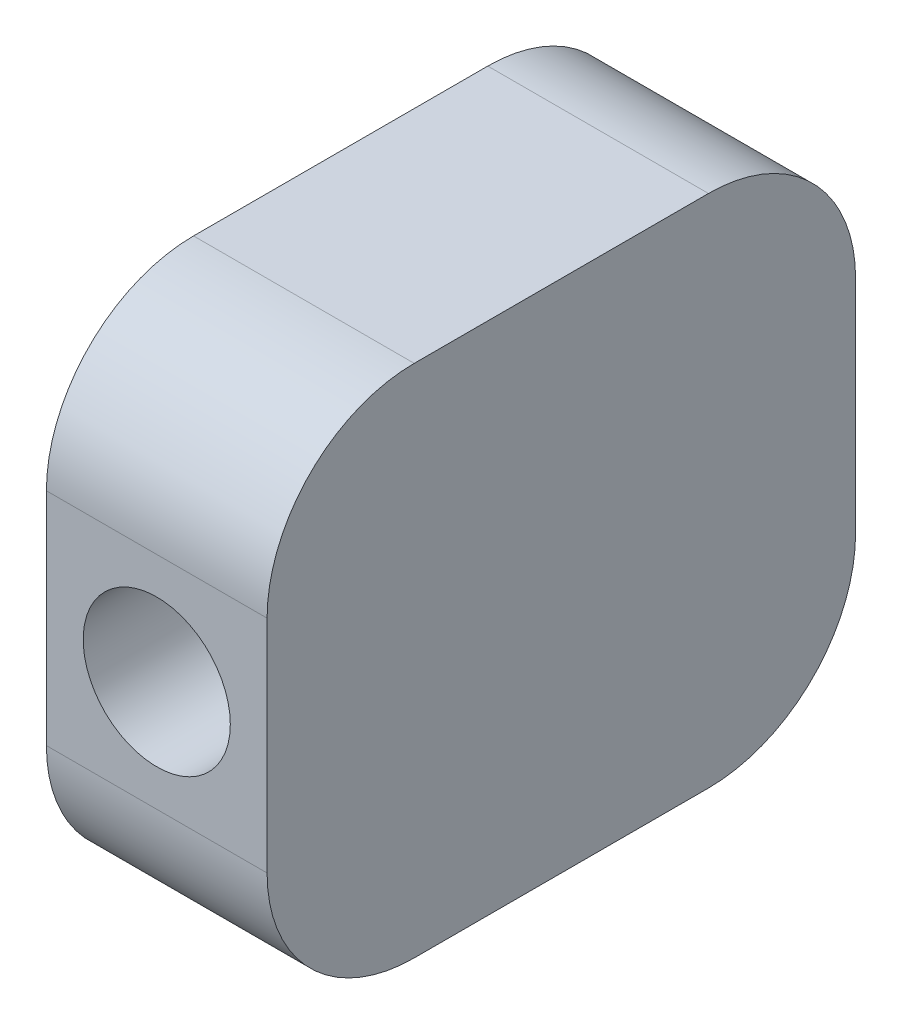
ISO-10303-21;
HEADER;
FILE_DESCRIPTION(('STEP AP214'),'2;1');
FILE_NAME('part.step','',(''),(''),'','','');
FILE_SCHEMA(('AUTOMOTIVE_DESIGN { 1 0 10303 214 1 1 1 1 }'));
ENDSEC;
DATA;
#1=APPLICATION_CONTEXT('core data for automotive mechanical design processes');
#2=APPLICATION_PROTOCOL_DEFINITION('international standard','automotive_design',2000,#1);
#3=PRODUCT_CONTEXT('',#1,'mechanical');
#4=PRODUCT('Part','Part','',(#3));
#5=PRODUCT_RELATED_PRODUCT_CATEGORY('part','',(#4));
#6=PRODUCT_DEFINITION_FORMATION('','',#4);
#7=PRODUCT_DEFINITION_CONTEXT('part definition',#1,'design');
#8=PRODUCT_DEFINITION('design','',#6,#7);
#9=PRODUCT_DEFINITION_SHAPE('','',#8);
#10=(LENGTH_UNIT() NAMED_UNIT(*) SI_UNIT(.MILLI.,.METRE.));
#11=(NAMED_UNIT(*) PLANE_ANGLE_UNIT() SI_UNIT($,.RADIAN.));
#12=(NAMED_UNIT(*) SI_UNIT($,.STERADIAN.) SOLID_ANGLE_UNIT());
#13=UNCERTAINTY_MEASURE_WITH_UNIT(LENGTH_MEASURE(1.E-05),#10,'distance_accuracy_value','');
#14=(GEOMETRIC_REPRESENTATION_CONTEXT(3) GLOBAL_UNCERTAINTY_ASSIGNED_CONTEXT((#13)) GLOBAL_UNIT_ASSIGNED_CONTEXT((#10,
#11,#12)) REPRESENTATION_CONTEXT('',''));
#15=CARTESIAN_POINT('',(0.,0.,0.));
#16=DIRECTION('',(0.,0.,1.));
#17=DIRECTION('',(1.,0.,0.));
#18=AXIS2_PLACEMENT_3D('',#15,#16,#17);
#19=CARTESIAN_POINT('',(30.,15.,20.));
#20=DIRECTION('',(-1.,0.,0.));
#21=DIRECTION('',(0.,0.,1.));
#22=AXIS2_PLACEMENT_3D('',#19,#20,#21);
#23=CYLINDRICAL_SURFACE('',#22,20.);
#24=DIRECTION('',(-1.,0.,0.));
#25=VECTOR('',#24,1.);
#26=CARTESIAN_POINT('',(30.,15.,40.));
#27=LINE('',#26,#25);
#28=CARTESIAN_POINT('',(30.,15.,40.));
#29=VERTEX_POINT('',#28);
#30=CARTESIAN_POINT('',(0.,15.,40.));
#31=VERTEX_POINT('',#30);
#32=EDGE_CURVE('E160',#29,#31,#27,.T.);
#33=ORIENTED_EDGE('',*,*,#32,.F.);
#34=CARTESIAN_POINT('',(30.,15.,20.));
#35=DIRECTION('',(-1.,0.,0.));
#36=DIRECTION('',(0.,0.,1.));
#37=AXIS2_PLACEMENT_3D('',#34,#35,#36);
#38=CIRCLE('',#37,20.);
#39=CARTESIAN_POINT('',(30.,35.,20.));
#40=VERTEX_POINT('',#39);
#41=EDGE_CURVE('E49',#40,#29,#38,.F.);
#42=ORIENTED_EDGE('',*,*,#41,.F.);
#43=DIRECTION('',(-1.,0.,0.));
#44=VECTOR('',#43,1.);
#45=CARTESIAN_POINT('',(30.,35.,20.));
#46=LINE('',#45,#44);
#47=CARTESIAN_POINT('',(0.,35.,20.));
#48=VERTEX_POINT('',#47);
#49=EDGE_CURVE('E163',#48,#40,#46,.F.);
#50=ORIENTED_EDGE('',*,*,#49,.F.);
#51=CARTESIAN_POINT('',(0.,15.,20.));
#52=DIRECTION('',(-1.,0.,0.));
#53=DIRECTION('',(0.,0.,1.));
#54=AXIS2_PLACEMENT_3D('',#51,#52,#53);
#55=CIRCLE('',#54,20.);
#56=EDGE_CURVE('E11',#31,#48,#55,.T.);
#57=ORIENTED_EDGE('',*,*,#56,.F.);
#58=EDGE_LOOP('',(#33,#42,#50,#57));
#59=FACE_BOUND('',#58,.T.);
#60=ADVANCED_FACE('F42',(#59),#23,.T.);
#61=CARTESIAN_POINT('',(30.,-15.,20.));
#62=DIRECTION('',(-1.,0.,0.));
#63=DIRECTION('',(0.,0.,1.));
#64=AXIS2_PLACEMENT_3D('',#61,#62,#63);
#65=CYLINDRICAL_SURFACE('',#64,20.);
#66=DIRECTION('',(-1.,0.,0.));
#67=VECTOR('',#66,1.);
#68=CARTESIAN_POINT('',(30.,-35.,20.));
#69=LINE('',#68,#67);
#70=CARTESIAN_POINT('',(30.,-35.,20.));
#71=VERTEX_POINT('',#70);
#72=CARTESIAN_POINT('',(0.,-35.,20.));
#73=VERTEX_POINT('',#72);
#74=EDGE_CURVE('E149',#71,#73,#69,.T.);
#75=ORIENTED_EDGE('',*,*,#74,.F.);
#76=CARTESIAN_POINT('',(30.,-15.,20.));
#77=DIRECTION('',(-1.,0.,0.));
#78=DIRECTION('',(0.,0.,1.));
#79=AXIS2_PLACEMENT_3D('',#76,#77,#78);
#80=CIRCLE('',#79,20.);
#81=CARTESIAN_POINT('',(30.,-15.,40.));
#82=VERTEX_POINT('',#81);
#83=EDGE_CURVE('E155',#82,#71,#80,.F.);
#84=ORIENTED_EDGE('',*,*,#83,.F.);
#85=DIRECTION('',(-1.,0.,0.));
#86=VECTOR('',#85,1.);
#87=CARTESIAN_POINT('',(30.,-15.,40.));
#88=LINE('',#87,#86);
#89=CARTESIAN_POINT('',(0.,-15.,40.));
#90=VERTEX_POINT('',#89);
#91=EDGE_CURVE('E152',#90,#82,#88,.F.);
#92=ORIENTED_EDGE('',*,*,#91,.F.);
#93=CARTESIAN_POINT('',(0.,-15.,20.));
#94=DIRECTION('',(-1.,0.,0.));
#95=DIRECTION('',(0.,0.,1.));
#96=AXIS2_PLACEMENT_3D('',#93,#94,#95);
#97=CIRCLE('',#96,20.);
#98=EDGE_CURVE('E157',#73,#90,#97,.T.);
#99=ORIENTED_EDGE('',*,*,#98,.F.);
#100=EDGE_LOOP('',(#75,#84,#92,#99));
#101=FACE_BOUND('',#100,.T.);
#102=ADVANCED_FACE('F203',(#101),#65,.T.);
#103=CARTESIAN_POINT('',(30.,-15.,-20.));
#104=DIRECTION('',(1.,0.,0.));
#105=DIRECTION('',(0.,0.,-1.));
#106=AXIS2_PLACEMENT_3D('',#103,#104,#105);
#107=CYLINDRICAL_SURFACE('',#106,20.);
#108=DIRECTION('',(1.,0.,0.));
#109=VECTOR('',#108,1.);
#110=CARTESIAN_POINT('',(30.,-35.,-20.));
#111=LINE('',#110,#109);
#112=CARTESIAN_POINT('',(0.,-35.,-20.));
#113=VERTEX_POINT('',#112);
#114=CARTESIAN_POINT('',(30.,-35.,-20.));
#115=VERTEX_POINT('',#114);
#116=EDGE_CURVE('E114',#113,#115,#111,.T.);
#117=ORIENTED_EDGE('',*,*,#116,.F.);
#118=CARTESIAN_POINT('',(0.,-15.,-20.));
#119=DIRECTION('',(-1.,0.,0.));
#120=DIRECTION('',(0.,0.,1.));
#121=AXIS2_PLACEMENT_3D('',#118,#119,#120);
#122=CIRCLE('',#121,20.);
#123=CARTESIAN_POINT('',(0.,-15.,-40.));
#124=VERTEX_POINT('',#123);
#125=EDGE_CURVE('E144',#124,#113,#122,.T.);
#126=ORIENTED_EDGE('',*,*,#125,.F.);
#127=DIRECTION('',(1.,0.,0.));
#128=VECTOR('',#127,1.);
#129=CARTESIAN_POINT('',(30.,-15.,-40.));
#130=LINE('',#129,#128);
#131=CARTESIAN_POINT('',(30.,-15.,-40.));
#132=VERTEX_POINT('',#131);
#133=EDGE_CURVE('E141',#132,#124,#130,.F.);
#134=ORIENTED_EDGE('',*,*,#133,.F.);
#135=CARTESIAN_POINT('',(30.,-15.,-20.));
#136=DIRECTION('',(-1.,0.,0.));
#137=DIRECTION('',(0.,0.,1.));
#138=AXIS2_PLACEMENT_3D('',#135,#136,#137);
#139=CIRCLE('',#138,20.);
#140=EDGE_CURVE('E147',#115,#132,#139,.F.);
#141=ORIENTED_EDGE('',*,*,#140,.F.);
#142=EDGE_LOOP('',(#117,#126,#134,#141));
#143=FACE_BOUND('',#142,.T.);
#144=ADVANCED_FACE('F208',(#143),#107,.T.);
#145=CARTESIAN_POINT('',(30.,15.,-20.));
#146=DIRECTION('',(-1.,0.,0.));
#147=DIRECTION('',(0.,0.,1.));
#148=AXIS2_PLACEMENT_3D('',#145,#146,#147);
#149=CYLINDRICAL_SURFACE('',#148,20.);
#150=DIRECTION('',(-1.,0.,0.));
#151=VECTOR('',#150,1.);
#152=CARTESIAN_POINT('',(30.,35.,-20.));
#153=LINE('',#152,#151);
#154=CARTESIAN_POINT('',(30.,35.,-20.));
#155=VERTEX_POINT('',#154);
#156=CARTESIAN_POINT('',(0.,35.,-20.));
#157=VERTEX_POINT('',#156);
#158=EDGE_CURVE('E109',#155,#157,#153,.T.);
#159=ORIENTED_EDGE('',*,*,#158,.F.);
#160=CARTESIAN_POINT('',(30.,15.,-20.));
#161=DIRECTION('',(-1.,0.,0.));
#162=DIRECTION('',(0.,0.,1.));
#163=AXIS2_PLACEMENT_3D('',#160,#161,#162);
#164=CIRCLE('',#163,20.);
#165=CARTESIAN_POINT('',(30.,15.,-40.));
#166=VERTEX_POINT('',#165);
#167=EDGE_CURVE('E115',#166,#155,#164,.F.);
#168=ORIENTED_EDGE('',*,*,#167,.F.);
#169=DIRECTION('',(-1.,0.,0.));
#170=VECTOR('',#169,1.);
#171=CARTESIAN_POINT('',(30.,15.,-40.));
#172=LINE('',#171,#170);
#173=CARTESIAN_POINT('',(0.,15.,-40.));
#174=VERTEX_POINT('',#173);
#175=EDGE_CURVE('E112',#174,#166,#172,.F.);
#176=ORIENTED_EDGE('',*,*,#175,.F.);
#177=CARTESIAN_POINT('',(0.,15.,-20.));
#178=DIRECTION('',(-1.,0.,0.));
#179=DIRECTION('',(0.,0.,1.));
#180=AXIS2_PLACEMENT_3D('',#177,#178,#179);
#181=CIRCLE('',#180,20.);
#182=EDGE_CURVE('E105',#157,#174,#181,.T.);
#183=ORIENTED_EDGE('',*,*,#182,.F.);
#184=EDGE_LOOP('',(#159,#168,#176,#183));
#185=FACE_BOUND('',#184,.T.);
#186=ADVANCED_FACE('F107',(#185),#149,.T.);
#187=CARTESIAN_POINT('',(30.,-35.,-40.));
#188=DIRECTION('',(0.,0.,1.));
#189=DIRECTION('',(1.,0.,0.));
#190=AXIS2_PLACEMENT_3D('',#187,#188,#189);
#191=PLANE('',#190);
#192=DIRECTION('',(0.,1.,0.));
#193=VECTOR('',#192,1.);
#194=CARTESIAN_POINT('',(30.,-35.,-40.));
#195=LINE('',#194,#193);
#196=EDGE_CURVE('E135',#132,#166,#195,.T.);
#197=ORIENTED_EDGE('',*,*,#196,.F.);
#198=ORIENTED_EDGE('',*,*,#133,.T.);
#199=DIRECTION('',(0.,1.,0.));
#200=VECTOR('',#199,1.);
#201=CARTESIAN_POINT('',(0.,-35.,-40.));
#202=LINE('',#201,#200);
#203=EDGE_CURVE('E127',#124,#174,#202,.T.);
#204=ORIENTED_EDGE('',*,*,#203,.T.);
#205=ORIENTED_EDGE('',*,*,#175,.T.);
#206=EDGE_LOOP('',(#197,#198,#204,#205));
#207=FACE_BOUND('',#206,.T.);
#208=ADVANCED_FACE('F200',(#207),#191,.F.);
#209=CARTESIAN_POINT('',(30.,35.,40.));
#210=DIRECTION('',(0.,-1.,0.));
#211=DIRECTION('',(0.,0.,-1.));
#212=AXIS2_PLACEMENT_3D('',#209,#210,#211);
#213=PLANE('',#212);
#214=DIRECTION('',(0.,0.,1.));
#215=VECTOR('',#214,1.);
#216=CARTESIAN_POINT('',(0.,35.,40.));
#217=LINE('',#216,#215);
#218=EDGE_CURVE('E120',#157,#48,#217,.T.);
#219=ORIENTED_EDGE('',*,*,#218,.T.);
#220=ORIENTED_EDGE('',*,*,#49,.T.);
#221=DIRECTION('',(0.,0.,1.));
#222=VECTOR('',#221,1.);
#223=CARTESIAN_POINT('',(30.,35.,40.));
#224=LINE('',#223,#222);
#225=EDGE_CURVE('E122',#155,#40,#224,.T.);
#226=ORIENTED_EDGE('',*,*,#225,.F.);
#227=ORIENTED_EDGE('',*,*,#158,.T.);
#228=EDGE_LOOP('',(#219,#220,#226,#227));
#229=FACE_BOUND('',#228,.T.);
#230=ADVANCED_FACE('F119',(#229),#213,.F.);
#231=CARTESIAN_POINT('',(30.,-35.,40.));
#232=DIRECTION('',(0.,0.,-1.));
#233=DIRECTION('',(-1.,0.,0.));
#234=AXIS2_PLACEMENT_3D('',#231,#232,#233);
#235=PLANE('',#234);
#236=CARTESIAN_POINT('',(15.,0.,40.));
#237=DIRECTION('',(0.,0.,1.));
#238=DIRECTION('',(1.,0.,0.));
#239=AXIS2_PLACEMENT_3D('',#236,#237,#238);
#240=CIRCLE('',#239,10.);
#241=CARTESIAN_POINT('',(25.,0.,40.));
#242=VERTEX_POINT('',#241);
#243=EDGE_CURVE('E176',#242,#242,#240,.T.);
#244=ORIENTED_EDGE('',*,*,#243,.F.);
#245=EDGE_LOOP('',(#244));
#246=FACE_BOUND('',#245,.T.);
#247=DIRECTION('',(0.,-1.,0.));
#248=VECTOR('',#247,1.);
#249=CARTESIAN_POINT('',(30.,-35.,40.));
#250=LINE('',#249,#248);
#251=EDGE_CURVE('E167',#29,#82,#250,.T.);
#252=ORIENTED_EDGE('',*,*,#251,.F.);
#253=ORIENTED_EDGE('',*,*,#32,.T.);
#254=DIRECTION('',(0.,-1.,0.));
#255=VECTOR('',#254,1.);
#256=CARTESIAN_POINT('',(0.,-35.,40.));
#257=LINE('',#256,#255);
#258=EDGE_CURVE('E126',#31,#90,#257,.T.);
#259=ORIENTED_EDGE('',*,*,#258,.T.);
#260=ORIENTED_EDGE('',*,*,#91,.T.);
#261=EDGE_LOOP('',(#252,#253,#259,#260));
#262=FACE_BOUND('',#261,.T.);
#263=ADVANCED_FACE('F170',(#246,#262),#235,.F.);
#264=CARTESIAN_POINT('',(30.,-35.,40.));
#265=DIRECTION('',(0.,1.,0.));
#266=DIRECTION('',(0.,0.,1.));
#267=AXIS2_PLACEMENT_3D('',#264,#265,#266);
#268=PLANE('',#267);
#269=DIRECTION('',(0.,0.,-1.));
#270=VECTOR('',#269,1.);
#271=CARTESIAN_POINT('',(30.,-35.,40.));
#272=LINE('',#271,#270);
#273=EDGE_CURVE('E123',#71,#115,#272,.T.);
#274=ORIENTED_EDGE('',*,*,#273,.F.);
#275=ORIENTED_EDGE('',*,*,#74,.T.);
#276=DIRECTION('',(0.,0.,-1.));
#277=VECTOR('',#276,1.);
#278=CARTESIAN_POINT('',(0.,-35.,40.));
#279=LINE('',#278,#277);
#280=EDGE_CURVE('E129',#73,#113,#279,.T.);
#281=ORIENTED_EDGE('',*,*,#280,.T.);
#282=ORIENTED_EDGE('',*,*,#116,.T.);
#283=EDGE_LOOP('',(#274,#275,#281,#282));
#284=FACE_BOUND('',#283,.T.);
#285=ADVANCED_FACE('F191',(#284),#268,.F.);
#286=CARTESIAN_POINT('',(30.,0.,0.));
#287=DIRECTION('',(-1.,0.,0.));
#288=DIRECTION('',(0.,0.,1.));
#289=AXIS2_PLACEMENT_3D('',#286,#287,#288);
#290=PLANE('',#289);
#291=ORIENTED_EDGE('',*,*,#225,.T.);
#292=ORIENTED_EDGE('',*,*,#41,.T.);
#293=ORIENTED_EDGE('',*,*,#251,.T.);
#294=ORIENTED_EDGE('',*,*,#83,.T.);
#295=ORIENTED_EDGE('',*,*,#273,.T.);
#296=ORIENTED_EDGE('',*,*,#140,.T.);
#297=ORIENTED_EDGE('',*,*,#196,.T.);
#298=ORIENTED_EDGE('',*,*,#167,.T.);
#299=EDGE_LOOP('',(#291,#292,#293,#294,#295,#296,#297,#298));
#300=FACE_BOUND('',#299,.T.);
#301=ADVANCED_FACE('F165',(#300),#290,.F.);
#302=CARTESIAN_POINT('',(0.,0.,0.));
#303=DIRECTION('',(-1.,0.,0.));
#304=DIRECTION('',(0.,0.,1.));
#305=AXIS2_PLACEMENT_3D('',#302,#303,#304);
#306=PLANE('',#305);
#307=ORIENTED_EDGE('',*,*,#258,.F.);
#308=ORIENTED_EDGE('',*,*,#56,.T.);
#309=ORIENTED_EDGE('',*,*,#218,.F.);
#310=ORIENTED_EDGE('',*,*,#182,.T.);
#311=ORIENTED_EDGE('',*,*,#203,.F.);
#312=ORIENTED_EDGE('',*,*,#125,.T.);
#313=ORIENTED_EDGE('',*,*,#280,.F.);
#314=ORIENTED_EDGE('',*,*,#98,.T.);
#315=EDGE_LOOP('',(#307,#308,#309,#310,#311,#312,#313,#314));
#316=FACE_BOUND('',#315,.T.);
#317=ADVANCED_FACE('F125',(#316),#306,.T.);
#318=CARTESIAN_POINT('',(15.,0.,-9.99999999999999));
#319=DIRECTION('',(0.,0.,1.));
#320=DIRECTION('',(1.,0.,0.));
#321=AXIS2_PLACEMENT_3D('',#318,#319,#320);
#322=CYLINDRICAL_SURFACE('',#321,10.);
#323=CARTESIAN_POINT('',(15.,0.,-9.99999999999999));
#324=DIRECTION('',(0.,0.,1.));
#325=DIRECTION('',(1.,0.,0.));
#326=AXIS2_PLACEMENT_3D('',#323,#324,#325);
#327=CIRCLE('',#326,10.);
#328=CARTESIAN_POINT('',(25.,0.,-9.99999999999999));
#329=VERTEX_POINT('',#328);
#330=EDGE_CURVE('E131',#329,#329,#327,.T.);
#331=ORIENTED_EDGE('',*,*,#330,.F.);
#332=EDGE_LOOP('',(#331));
#333=FACE_BOUND('',#332,.T.);
#334=ORIENTED_EDGE('',*,*,#243,.T.);
#335=EDGE_LOOP('',(#334));
#336=FACE_BOUND('',#335,.T.);
#337=ADVANCED_FACE('F184',(#333,#336),#322,.F.);
#338=CARTESIAN_POINT('',(15.,0.,-9.99999999999999));
#339=DIRECTION('',(0.,0.,1.));
#340=DIRECTION('',(1.,0.,0.));
#341=AXIS2_PLACEMENT_3D('',#338,#339,#340);
#342=PLANE('',#341);
#343=ORIENTED_EDGE('',*,*,#330,.T.);
#344=EDGE_LOOP('',(#343));
#345=FACE_BOUND('',#344,.T.);
#346=ADVANCED_FACE('F182',(#345),#342,.T.);
#347=CLOSED_SHELL('',(#60,#102,#144,#186,#208,#230,#263,#285,#301,#317,#337,#346));
#348=MANIFOLD_SOLID_BREP('B2',#347);
#349=ADVANCED_BREP_SHAPE_REPRESENTATION('',(#18,#348),#14);
#350=SHAPE_DEFINITION_REPRESENTATION(#9,#349);
ENDSEC;
END-ISO-10303-21;
